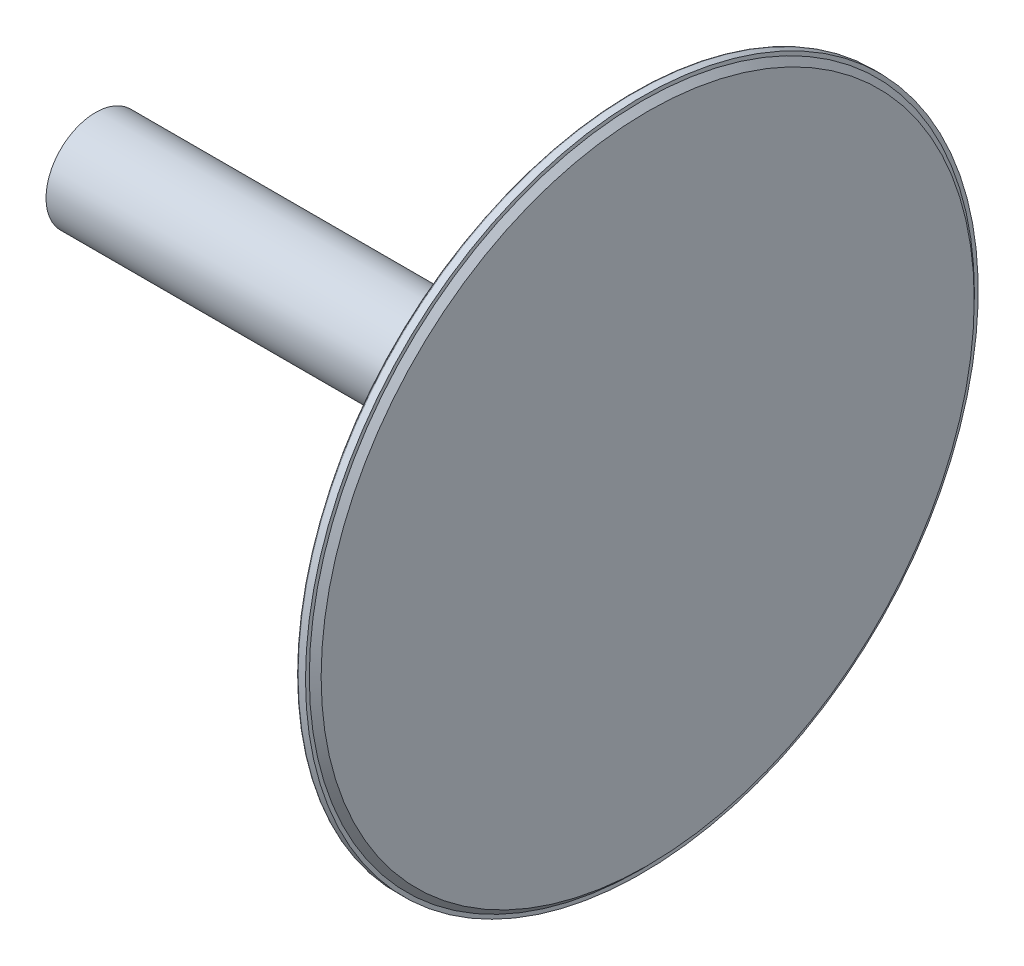
ISO-10303-21;
HEADER;
FILE_DESCRIPTION(('STEP AP214'),'2;1');
FILE_NAME('part.step','',(''),(''),'','','');
FILE_SCHEMA(('AUTOMOTIVE_DESIGN { 1 0 10303 214 1 1 1 1 }'));
ENDSEC;
DATA;
#1=APPLICATION_CONTEXT('core data for automotive mechanical design processes');
#2=APPLICATION_PROTOCOL_DEFINITION('international standard','automotive_design',2000,#1);
#3=PRODUCT_CONTEXT('',#1,'mechanical');
#4=PRODUCT('Part','Part','',(#3));
#5=PRODUCT_RELATED_PRODUCT_CATEGORY('part','',(#4));
#6=PRODUCT_DEFINITION_FORMATION('','',#4);
#7=PRODUCT_DEFINITION_CONTEXT('part definition',#1,'design');
#8=PRODUCT_DEFINITION('design','',#6,#7);
#9=PRODUCT_DEFINITION_SHAPE('','',#8);
#10=(LENGTH_UNIT() NAMED_UNIT(*) SI_UNIT(.MILLI.,.METRE.));
#11=(NAMED_UNIT(*) PLANE_ANGLE_UNIT() SI_UNIT($,.RADIAN.));
#12=(NAMED_UNIT(*) SI_UNIT($,.STERADIAN.) SOLID_ANGLE_UNIT());
#13=UNCERTAINTY_MEASURE_WITH_UNIT(LENGTH_MEASURE(1.E-05),#10,'distance_accuracy_value','');
#14=(GEOMETRIC_REPRESENTATION_CONTEXT(3) GLOBAL_UNCERTAINTY_ASSIGNED_CONTEXT((#13)) GLOBAL_UNIT_ASSIGNED_CONTEXT((#10,
#11,#12)) REPRESENTATION_CONTEXT('',''));
#15=CARTESIAN_POINT('',(0.,0.,0.));
#16=DIRECTION('',(0.,0.,1.));
#17=DIRECTION('',(1.,0.,0.));
#18=AXIS2_PLACEMENT_3D('',#15,#16,#17);
#19=CARTESIAN_POINT('',(6.19999999999999,0.,0.));
#20=DIRECTION('',(-1.,0.,0.));
#21=DIRECTION('',(0.,0.,1.));
#22=AXIS2_PLACEMENT_3D('',#19,#20,#21);
#23=CONICAL_SURFACE('',#22,57.1,0.802399587838452);
#24=CARTESIAN_POINT('',(7.19999999999998,0.,0.));
#25=DIRECTION('',(-1.,0.,0.));
#26=DIRECTION('',(0.,0.,1.));
#27=AXIS2_PLACEMENT_3D('',#24,#25,#26);
#28=CIRCLE('',#27,56.0654056649339);
#29=CARTESIAN_POINT('',(7.19999999999998,0.,56.0654056649339));
#30=VERTEX_POINT('',#29);
#31=EDGE_CURVE('E58',#30,#30,#28,.T.);
#32=ORIENTED_EDGE('',*,*,#31,.T.);
#33=EDGE_LOOP('',(#32));
#34=FACE_BOUND('',#33,.T.);
#35=CARTESIAN_POINT('',(6.19999999999999,0.,0.));
#36=DIRECTION('',(-1.,0.,0.));
#37=DIRECTION('',(0.,0.,1.));
#38=AXIS2_PLACEMENT_3D('',#35,#36,#37);
#39=CIRCLE('',#38,57.1);
#40=CARTESIAN_POINT('',(6.19999999999999,0.,57.1));
#41=VERTEX_POINT('',#40);
#42=EDGE_CURVE('E85',#41,#41,#39,.T.);
#43=ORIENTED_EDGE('',*,*,#42,.F.);
#44=EDGE_LOOP('',(#43));
#45=FACE_BOUND('',#44,.T.);
#46=ADVANCED_FACE('F37',(#34,#45),#23,.T.);
#47=CARTESIAN_POINT('',(7.19999999999999,56.0654056649339,0.));
#48=DIRECTION('',(1.,0.,0.));
#49=DIRECTION('',(0.,0.,-1.));
#50=AXIS2_PLACEMENT_3D('',#47,#48,#49);
#51=PLANE('',#50);
#52=ORIENTED_EDGE('',*,*,#31,.F.);
#53=EDGE_LOOP('',(#52));
#54=FACE_BOUND('',#53,.T.);
#55=ADVANCED_FACE('F106',(#54),#51,.T.);
#56=CARTESIAN_POINT('',(-2.80000000000001,0.,0.));
#57=DIRECTION('',(-1.,0.,0.));
#58=DIRECTION('',(0.,0.,1.));
#59=AXIS2_PLACEMENT_3D('',#56,#57,#58);
#60=PLANE('',#59);
#61=CARTESIAN_POINT('',(-2.80000000000001,0.,0.));
#62=DIRECTION('',(-1.,0.,0.));
#63=DIRECTION('',(0.,0.,1.));
#64=AXIS2_PLACEMENT_3D('',#61,#62,#63);
#65=CIRCLE('',#64,9.72702232430034);
#66=CARTESIAN_POINT('',(-2.80000000000001,0.,9.72702232430034));
#67=VERTEX_POINT('',#66);
#68=EDGE_CURVE('E52',#67,#67,#65,.T.);
#69=ORIENTED_EDGE('',*,*,#68,.T.);
#70=EDGE_LOOP('',(#69));
#71=FACE_BOUND('',#70,.T.);
#72=CARTESIAN_POINT('',(-2.80000000000001,0.,0.));
#73=DIRECTION('',(-1.,0.,0.));
#74=DIRECTION('',(0.,0.,1.));
#75=AXIS2_PLACEMENT_3D('',#72,#73,#74);
#76=CIRCLE('',#75,8.49999999999725);
#77=CARTESIAN_POINT('',(-2.80000000000001,0.,8.49999999999725));
#78=VERTEX_POINT('',#77);
#79=EDGE_CURVE('E57',#78,#78,#76,.T.);
#80=ORIENTED_EDGE('',*,*,#79,.F.);
#81=EDGE_LOOP('',(#80));
#82=FACE_BOUND('',#81,.T.);
#83=ADVANCED_FACE('F103',(#71,#82),#60,.T.);
#84=CARTESIAN_POINT('',(7.200025,0.,0.));
#85=DIRECTION('',(-1.,0.,0.));
#86=DIRECTION('',(0.,0.,1.));
#87=AXIS2_PLACEMENT_3D('',#84,#85,#86);
#88=CYLINDRICAL_SURFACE('',#87,10.);
#89=CARTESIAN_POINT('',(-2.05,0.,0.));
#90=DIRECTION('',(-1.,0.,0.));
#91=DIRECTION('',(0.,0.,1.));
#92=AXIS2_PLACEMENT_3D('',#89,#90,#91);
#93=CIRCLE('',#92,10.);
#94=CARTESIAN_POINT('',(-2.05,0.,10.));
#95=VERTEX_POINT('',#94);
#96=EDGE_CURVE('E48',#95,#95,#93,.F.);
#97=ORIENTED_EDGE('',*,*,#96,.T.);
#98=EDGE_LOOP('',(#97));
#99=FACE_BOUND('',#98,.T.);
#100=CARTESIAN_POINT('',(1.19999999999999,0.,0.));
#101=DIRECTION('',(-1.,0.,0.));
#102=DIRECTION('',(0.,0.,1.));
#103=AXIS2_PLACEMENT_3D('',#100,#101,#102);
#104=CIRCLE('',#103,10.);
#105=CARTESIAN_POINT('',(1.19999999999999,0.,10.));
#106=VERTEX_POINT('',#105);
#107=EDGE_CURVE('E61',#106,#106,#104,.T.);
#108=ORIENTED_EDGE('',*,*,#107,.T.);
#109=EDGE_LOOP('',(#108));
#110=FACE_BOUND('',#109,.T.);
#111=ADVANCED_FACE('F105',(#99,#110),#88,.T.);
#112=CARTESIAN_POINT('',(1.19999999999998,10.,0.));
#113=DIRECTION('',(1.,0.,0.));
#114=DIRECTION('',(0.,0.,-1.));
#115=AXIS2_PLACEMENT_3D('',#112,#113,#114);
#116=PLANE('',#115);
#117=CARTESIAN_POINT('',(1.19999999999997,0.,0.));
#118=DIRECTION('',(-1.,0.,0.));
#119=DIRECTION('',(0.,0.,1.));
#120=AXIS2_PLACEMENT_3D('',#117,#118,#119);
#121=CIRCLE('',#120,9.);
#122=CARTESIAN_POINT('',(1.19999999999997,0.,9.));
#123=VERTEX_POINT('',#122);
#124=EDGE_CURVE('E64',#123,#123,#121,.T.);
#125=ORIENTED_EDGE('',*,*,#124,.T.);
#126=EDGE_LOOP('',(#125));
#127=FACE_BOUND('',#126,.T.);
#128=ORIENTED_EDGE('',*,*,#107,.F.);
#129=EDGE_LOOP('',(#128));
#130=FACE_BOUND('',#129,.T.);
#131=ADVANCED_FACE('F113',(#127,#130),#116,.T.);
#132=CARTESIAN_POINT('',(7.200025,0.,0.));
#133=DIRECTION('',(-1.,0.,0.));
#134=DIRECTION('',(0.,0.,1.));
#135=AXIS2_PLACEMENT_3D('',#132,#133,#134);
#136=CYLINDRICAL_SURFACE('',#135,9.);
#137=CARTESIAN_POINT('',(2.49999999999997,0.,0.));
#138=DIRECTION('',(-1.,0.,0.));
#139=DIRECTION('',(0.,0.,1.));
#140=AXIS2_PLACEMENT_3D('',#137,#138,#139);
#141=CIRCLE('',#140,9.);
#142=CARTESIAN_POINT('',(2.49999999999997,0.,9.));
#143=VERTEX_POINT('',#142);
#144=EDGE_CURVE('E67',#143,#143,#141,.T.);
#145=ORIENTED_EDGE('',*,*,#144,.T.);
#146=EDGE_LOOP('',(#145));
#147=FACE_BOUND('',#146,.T.);
#148=ORIENTED_EDGE('',*,*,#124,.F.);
#149=EDGE_LOOP('',(#148));
#150=FACE_BOUND('',#149,.T.);
#151=ADVANCED_FACE('F143',(#147,#150),#136,.T.);
#152=CARTESIAN_POINT('',(2.49999999999998,9.,0.));
#153=DIRECTION('',(-1.,0.,0.));
#154=DIRECTION('',(0.,0.,1.));
#155=AXIS2_PLACEMENT_3D('',#152,#153,#154);
#156=PLANE('',#155);
#157=CARTESIAN_POINT('',(2.49999999999999,0.,0.));
#158=DIRECTION('',(-1.,0.,0.));
#159=DIRECTION('',(0.,0.,1.));
#160=AXIS2_PLACEMENT_3D('',#157,#158,#159);
#161=CIRCLE('',#160,10.);
#162=CARTESIAN_POINT('',(2.49999999999999,0.,10.));
#163=VERTEX_POINT('',#162);
#164=EDGE_CURVE('E70',#163,#163,#161,.T.);
#165=ORIENTED_EDGE('',*,*,#164,.T.);
#166=EDGE_LOOP('',(#165));
#167=FACE_BOUND('',#166,.T.);
#168=ORIENTED_EDGE('',*,*,#144,.F.);
#169=EDGE_LOOP('',(#168));
#170=FACE_BOUND('',#169,.T.);
#171=ADVANCED_FACE('F149',(#167,#170),#156,.T.);
#172=CARTESIAN_POINT('',(7.200025,0.,0.));
#173=DIRECTION('',(-1.,0.,0.));
#174=DIRECTION('',(0.,0.,1.));
#175=AXIS2_PLACEMENT_3D('',#172,#173,#174);
#176=CYLINDRICAL_SURFACE('',#175,10.);
#177=CARTESIAN_POINT('',(3.7,0.,0.));
#178=DIRECTION('',(-1.,0.,0.));
#179=DIRECTION('',(0.,0.,1.));
#180=AXIS2_PLACEMENT_3D('',#177,#178,#179);
#181=CIRCLE('',#180,10.);
#182=CARTESIAN_POINT('',(3.7,0.,10.));
#183=VERTEX_POINT('',#182);
#184=EDGE_CURVE('E73',#183,#183,#181,.T.);
#185=ORIENTED_EDGE('',*,*,#184,.T.);
#186=EDGE_LOOP('',(#185));
#187=FACE_BOUND('',#186,.T.);
#188=ORIENTED_EDGE('',*,*,#164,.F.);
#189=EDGE_LOOP('',(#188));
#190=FACE_BOUND('',#189,.T.);
#191=ADVANCED_FACE('F155',(#187,#190),#176,.T.);
#192=CARTESIAN_POINT('',(3.69999999999999,10.,0.));
#193=DIRECTION('',(-1.,0.,0.));
#194=DIRECTION('',(0.,0.,1.));
#195=AXIS2_PLACEMENT_3D('',#192,#193,#194);
#196=PLANE('',#195);
#197=CARTESIAN_POINT('',(3.69999999999999,0.,0.));
#198=DIRECTION('',(-1.,0.,0.));
#199=DIRECTION('',(0.,0.,1.));
#200=AXIS2_PLACEMENT_3D('',#197,#198,#199);
#201=CIRCLE('',#200,56.25);
#202=CARTESIAN_POINT('',(3.69999999999999,0.,56.25));
#203=VERTEX_POINT('',#202);
#204=EDGE_CURVE('E76',#203,#203,#201,.T.);
#205=ORIENTED_EDGE('',*,*,#204,.T.);
#206=EDGE_LOOP('',(#205));
#207=FACE_BOUND('',#206,.T.);
#208=ORIENTED_EDGE('',*,*,#184,.F.);
#209=EDGE_LOOP('',(#208));
#210=FACE_BOUND('',#209,.T.);
#211=ADVANCED_FACE('F159',(#207,#210),#196,.T.);
#212=CARTESIAN_POINT('',(7.200025,0.,0.));
#213=DIRECTION('',(-1.,0.,0.));
#214=DIRECTION('',(0.,0.,1.));
#215=AXIS2_PLACEMENT_3D('',#212,#213,#214);
#216=CYLINDRICAL_SURFACE('',#215,56.25);
#217=CARTESIAN_POINT('',(4.69999999999999,0.,0.));
#218=DIRECTION('',(-1.,0.,0.));
#219=DIRECTION('',(0.,0.,1.));
#220=AXIS2_PLACEMENT_3D('',#217,#218,#219);
#221=CIRCLE('',#220,56.25);
#222=CARTESIAN_POINT('',(4.69999999999999,0.,56.25));
#223=VERTEX_POINT('',#222);
#224=EDGE_CURVE('E79',#223,#223,#221,.T.);
#225=ORIENTED_EDGE('',*,*,#224,.T.);
#226=EDGE_LOOP('',(#225));
#227=FACE_BOUND('',#226,.T.);
#228=ORIENTED_EDGE('',*,*,#204,.F.);
#229=EDGE_LOOP('',(#228));
#230=FACE_BOUND('',#229,.T.);
#231=ADVANCED_FACE('F163',(#227,#230),#216,.T.);
#232=CARTESIAN_POINT('',(4.69999999999999,56.25,0.));
#233=DIRECTION('',(-1.,0.,0.));
#234=DIRECTION('',(0.,0.,1.));
#235=AXIS2_PLACEMENT_3D('',#232,#233,#234);
#236=PLANE('',#235);
#237=CARTESIAN_POINT('',(4.69999999999999,0.,0.));
#238=DIRECTION('',(-1.,0.,0.));
#239=DIRECTION('',(0.,0.,1.));
#240=AXIS2_PLACEMENT_3D('',#237,#238,#239);
#241=CIRCLE('',#240,57.5);
#242=CARTESIAN_POINT('',(4.69999999999999,0.,57.5));
#243=VERTEX_POINT('',#242);
#244=EDGE_CURVE('E44',#243,#243,#241,.T.);
#245=ORIENTED_EDGE('',*,*,#244,.T.);
#246=EDGE_LOOP('',(#245));
#247=FACE_BOUND('',#246,.T.);
#248=ORIENTED_EDGE('',*,*,#224,.F.);
#249=EDGE_LOOP('',(#248));
#250=FACE_BOUND('',#249,.T.);
#251=ADVANCED_FACE('F167',(#247,#250),#236,.T.);
#252=CARTESIAN_POINT('',(7.200025,0.,0.));
#253=DIRECTION('',(-1.,0.,0.));
#254=DIRECTION('',(0.,0.,1.));
#255=AXIS2_PLACEMENT_3D('',#252,#253,#254);
#256=CYLINDRICAL_SURFACE('',#255,57.75);
#257=CARTESIAN_POINT('',(4.94999999999999,0.,0.));
#258=DIRECTION('',(-1.,0.,0.));
#259=DIRECTION('',(0.,0.,1.));
#260=AXIS2_PLACEMENT_3D('',#257,#258,#259);
#261=CIRCLE('',#260,57.75);
#262=CARTESIAN_POINT('',(4.94999999999999,0.,57.75));
#263=VERTEX_POINT('',#262);
#264=EDGE_CURVE('E10',#263,#263,#261,.F.);
#265=ORIENTED_EDGE('',*,*,#264,.T.);
#266=EDGE_LOOP('',(#265));
#267=FACE_BOUND('',#266,.T.);
#268=CARTESIAN_POINT('',(6.2,0.,0.));
#269=DIRECTION('',(-1.,0.,0.));
#270=DIRECTION('',(0.,0.,1.));
#271=AXIS2_PLACEMENT_3D('',#268,#269,#270);
#272=CIRCLE('',#271,57.75);
#273=CARTESIAN_POINT('',(6.2,0.,57.75));
#274=VERTEX_POINT('',#273);
#275=EDGE_CURVE('E82',#274,#274,#272,.T.);
#276=ORIENTED_EDGE('',*,*,#275,.T.);
#277=EDGE_LOOP('',(#276));
#278=FACE_BOUND('',#277,.T.);
#279=ADVANCED_FACE('F171',(#267,#278),#256,.T.);
#280=CARTESIAN_POINT('',(6.2,57.75,0.));
#281=DIRECTION('',(1.,0.,0.));
#282=DIRECTION('',(0.,0.,-1.));
#283=AXIS2_PLACEMENT_3D('',#280,#281,#282);
#284=PLANE('',#283);
#285=ORIENTED_EDGE('',*,*,#42,.T.);
#286=EDGE_LOOP('',(#285));
#287=FACE_BOUND('',#286,.T.);
#288=ORIENTED_EDGE('',*,*,#275,.F.);
#289=EDGE_LOOP('',(#288));
#290=FACE_BOUND('',#289,.T.);
#291=ADVANCED_FACE('F99',(#287,#290),#284,.T.);
#292=CARTESIAN_POINT('',(-87.6,0.,0.));
#293=DIRECTION('',(1.,0.,0.));
#294=DIRECTION('',(0.,0.,-1.));
#295=AXIS2_PLACEMENT_3D('',#292,#293,#294);
#296=CYLINDRICAL_SURFACE('',#295,8.49999999999725);
#297=CARTESIAN_POINT('',(-87.6,0.,0.));
#298=DIRECTION('',(-1.,0.,0.));
#299=DIRECTION('',(0.,0.,1.));
#300=AXIS2_PLACEMENT_3D('',#297,#298,#299);
#301=CIRCLE('',#300,8.49999999999725);
#302=CARTESIAN_POINT('',(-87.6,0.,8.49999999999725));
#303=VERTEX_POINT('',#302);
#304=EDGE_CURVE('E88',#303,#303,#301,.T.);
#305=ORIENTED_EDGE('',*,*,#304,.F.);
#306=EDGE_LOOP('',(#305));
#307=FACE_BOUND('',#306,.T.);
#308=ORIENTED_EDGE('',*,*,#79,.T.);
#309=EDGE_LOOP('',(#308));
#310=FACE_BOUND('',#309,.T.);
#311=ADVANCED_FACE('F96',(#307,#310),#296,.T.);
#312=CARTESIAN_POINT('',(-87.6,0.,0.));
#313=DIRECTION('',(-1.,0.,0.));
#314=DIRECTION('',(0.,0.,1.));
#315=AXIS2_PLACEMENT_3D('',#312,#313,#314);
#316=PLANE('',#315);
#317=ORIENTED_EDGE('',*,*,#304,.T.);
#318=EDGE_LOOP('',(#317));
#319=FACE_BOUND('',#318,.T.);
#320=ADVANCED_FACE('F94',(#319),#316,.T.);
#321=CARTESIAN_POINT('',(-2.80000000000001,0.,0.));
#322=DIRECTION('',(1.,0.,0.));
#323=DIRECTION('',(0.,0.,-1.));
#324=AXIS2_PLACEMENT_3D('',#321,#322,#323);
#325=CONICAL_SURFACE('',#324,9.72702232430034,0.349065850398868);
#326=ORIENTED_EDGE('',*,*,#96,.F.);
#327=EDGE_LOOP('',(#326));
#328=FACE_BOUND('',#327,.T.);
#329=ORIENTED_EDGE('',*,*,#68,.F.);
#330=EDGE_LOOP('',(#329));
#331=FACE_BOUND('',#330,.T.);
#332=ADVANCED_FACE('F125',(#328,#331),#325,.T.);
#333=CARTESIAN_POINT('',(4.94999999999999,0.,0.));
#334=DIRECTION('',(-1.,0.,0.));
#335=DIRECTION('',(0.,0.,1.));
#336=AXIS2_PLACEMENT_3D('',#333,#334,#335);
#337=TOROIDAL_SURFACE('',#336,57.5,0.25);
#338=ORIENTED_EDGE('',*,*,#264,.F.);
#339=EDGE_LOOP('',(#338));
#340=FACE_BOUND('',#339,.T.);
#341=ORIENTED_EDGE('',*,*,#244,.F.);
#342=EDGE_LOOP('',(#341));
#343=FACE_BOUND('',#342,.T.);
#344=ADVANCED_FACE('F39',(#340,#343),#337,.T.);
#345=CLOSED_SHELL('',(#46,#55,#83,#111,#131,#151,#171,#191,#211,#231,#251,#279,#291,#311,#320,
#332,#344));
#346=MANIFOLD_SOLID_BREP('B2',#345);
#347=ADVANCED_BREP_SHAPE_REPRESENTATION('',(#18,#346),#14);
#348=SHAPE_DEFINITION_REPRESENTATION(#9,#347);
ENDSEC;
END-ISO-10303-21;
